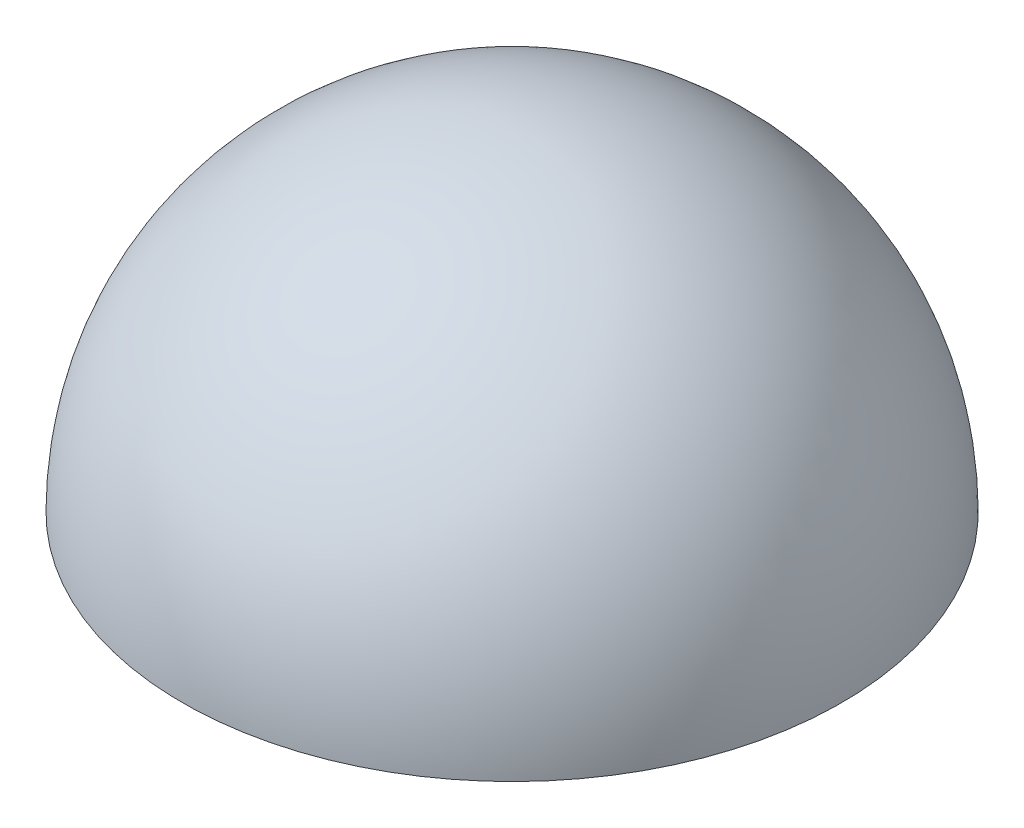
ISO-10303-21;
HEADER;
FILE_DESCRIPTION(('STEP AP214'),'2;1');
FILE_NAME('part.step','',(''),(''),'','','');
FILE_SCHEMA(('AUTOMOTIVE_DESIGN { 1 0 10303 214 1 1 1 1 }'));
ENDSEC;
DATA;
#1=APPLICATION_CONTEXT('core data for automotive mechanical design processes');
#2=APPLICATION_PROTOCOL_DEFINITION('international standard','automotive_design',2000,#1);
#3=PRODUCT_CONTEXT('',#1,'mechanical');
#4=PRODUCT('Part','Part','',(#3));
#5=PRODUCT_RELATED_PRODUCT_CATEGORY('part','',(#4));
#6=PRODUCT_DEFINITION_FORMATION('','',#4);
#7=PRODUCT_DEFINITION_CONTEXT('part definition',#1,'design');
#8=PRODUCT_DEFINITION('design','',#6,#7);
#9=PRODUCT_DEFINITION_SHAPE('','',#8);
#10=(LENGTH_UNIT() NAMED_UNIT(*) SI_UNIT(.MILLI.,.METRE.));
#11=(NAMED_UNIT(*) PLANE_ANGLE_UNIT() SI_UNIT($,.RADIAN.));
#12=(NAMED_UNIT(*) SI_UNIT($,.STERADIAN.) SOLID_ANGLE_UNIT());
#13=UNCERTAINTY_MEASURE_WITH_UNIT(LENGTH_MEASURE(1.E-05),#10,'distance_accuracy_value','');
#14=(GEOMETRIC_REPRESENTATION_CONTEXT(3) GLOBAL_UNCERTAINTY_ASSIGNED_CONTEXT((#13)) GLOBAL_UNIT_ASSIGNED_CONTEXT((#10,
#11,#12)) REPRESENTATION_CONTEXT('',''));
#15=CARTESIAN_POINT('',(0.,0.,0.));
#16=DIRECTION('',(0.,0.,1.));
#17=DIRECTION('',(1.,0.,0.));
#18=AXIS2_PLACEMENT_3D('',#15,#16,#17);
#19=CARTESIAN_POINT('',(0.,0.,0.));
#20=DIRECTION('',(-1.,0.,0.));
#21=DIRECTION('',(0.,0.,1.));
#22=AXIS2_PLACEMENT_3D('',#19,#20,#21);
#23=SPHERICAL_SURFACE('',#22,33.5);
#24=CARTESIAN_POINT('',(0.,0.,0.));
#25=DIRECTION('',(0.,-1.,0.));
#26=DIRECTION('',(0.,0.,-1.));
#27=AXIS2_PLACEMENT_3D('',#24,#25,#26);
#28=SPHERICAL_SURFACE('',#27,33.5);
#29=CARTESIAN_POINT('',(0.,0.,0.));
#30=DIRECTION('',(0.,-1.,0.));
#31=DIRECTION('',(0.,0.,-1.));
#32=AXIS2_PLACEMENT_3D('',#29,#30,#31);
#33=CIRCLE('',#32,33.5);
#34=CARTESIAN_POINT('',(0.,2.3392924970249E-13,-33.5));
#35=VERTEX_POINT('',#34);
#36=EDGE_CURVE('E10',#35,#35,#33,.T.);
#37=ORIENTED_EDGE('',*,*,#36,.F.);
#38=EDGE_LOOP('',(#37));
#39=FACE_BOUND('',#38,.T.);
#40=ADVANCED_FACE('F33',(#39),#28,.T.);
#41=CARTESIAN_POINT('',(0.,0.,0.));
#42=DIRECTION('',(0.,-1.,0.));
#43=DIRECTION('',(0.,0.,-1.));
#44=AXIS2_PLACEMENT_3D('',#41,#42,#43);
#45=PLANE('',#44);
#46=ORIENTED_EDGE('',*,*,#36,.T.);
#47=EDGE_LOOP('',(#46));
#48=FACE_BOUND('',#47,.T.);
#49=ADVANCED_FACE('F40',(#48),#45,.T.);
#50=CLOSED_SHELL('',(#40,#49));
#51=MANIFOLD_SOLID_BREP('B2',#50);
#52=ADVANCED_BREP_SHAPE_REPRESENTATION('',(#18,#51),#14);
#53=SHAPE_DEFINITION_REPRESENTATION(#9,#52);
ENDSEC;
END-ISO-10303-21;
